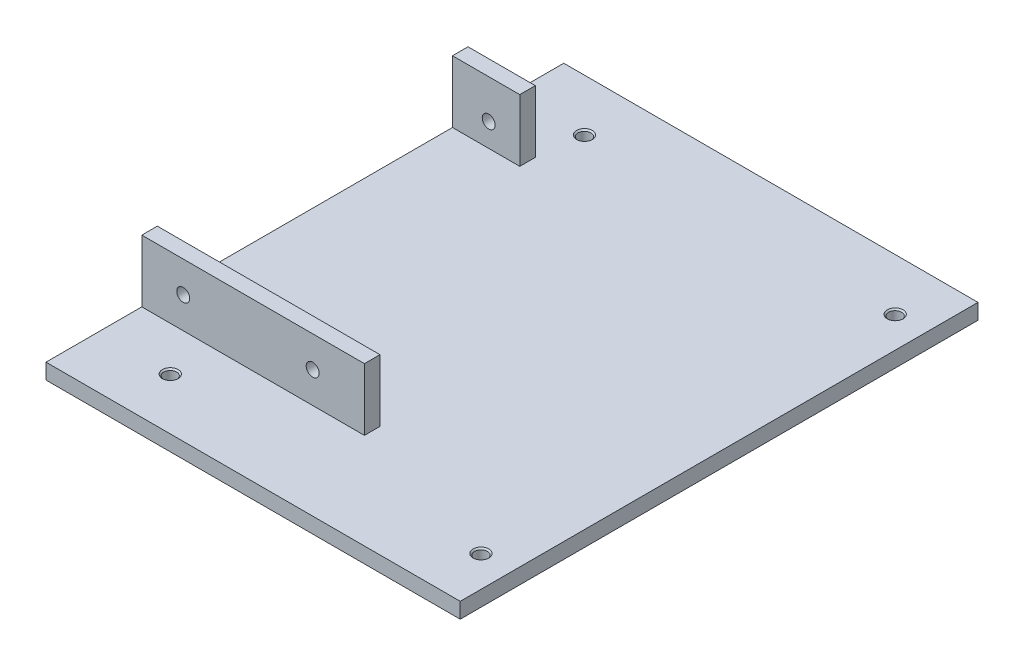
ISO-10303-21;
HEADER;
FILE_DESCRIPTION(('STEP AP214'),'2;1');
FILE_NAME('part.step','',(''),(''),'','','');
FILE_SCHEMA(('AUTOMOTIVE_DESIGN { 1 0 10303 214 1 1 1 1 }'));
ENDSEC;
DATA;
#1=APPLICATION_CONTEXT('core data for automotive mechanical design processes');
#2=APPLICATION_PROTOCOL_DEFINITION('international standard','automotive_design',2000,#1);
#3=PRODUCT_CONTEXT('',#1,'mechanical');
#4=PRODUCT('Part','Part','',(#3));
#5=PRODUCT_RELATED_PRODUCT_CATEGORY('part','',(#4));
#6=PRODUCT_DEFINITION_FORMATION('','',#4);
#7=PRODUCT_DEFINITION_CONTEXT('part definition',#1,'design');
#8=PRODUCT_DEFINITION('design','',#6,#7);
#9=PRODUCT_DEFINITION_SHAPE('','',#8);
#10=(LENGTH_UNIT() NAMED_UNIT(*) SI_UNIT(.MILLI.,.METRE.));
#11=(NAMED_UNIT(*) PLANE_ANGLE_UNIT() SI_UNIT($,.RADIAN.));
#12=(NAMED_UNIT(*) SI_UNIT($,.STERADIAN.) SOLID_ANGLE_UNIT());
#13=UNCERTAINTY_MEASURE_WITH_UNIT(LENGTH_MEASURE(1.E-05),#10,'distance_accuracy_value','');
#14=(GEOMETRIC_REPRESENTATION_CONTEXT(3) GLOBAL_UNCERTAINTY_ASSIGNED_CONTEXT((#13)) GLOBAL_UNIT_ASSIGNED_CONTEXT((#10,
#11,#12)) REPRESENTATION_CONTEXT('',''));
#15=CARTESIAN_POINT('',(0.,0.,0.));
#16=DIRECTION('',(0.,0.,1.));
#17=DIRECTION('',(1.,0.,0.));
#18=AXIS2_PLACEMENT_3D('',#15,#16,#17);
#19=CARTESIAN_POINT('',(0.,0.,-9.83755723121744));
#20=DIRECTION('',(0.,0.,1.));
#21=DIRECTION('',(1.,0.,0.));
#22=AXIS2_PLACEMENT_3D('',#19,#20,#21);
#23=PLANE('',#22);
#24=DIRECTION('',(1.,0.,0.));
#25=VECTOR('',#24,1.);
#26=CARTESIAN_POINT('',(-60.7657345094222,3.,-9.83755723121744));
#27=LINE('',#26,#25);
#28=CARTESIAN_POINT('',(-60.7657345094222,3.,-9.83755723121744));
#29=VERTEX_POINT('',#28);
#30=CARTESIAN_POINT('',(-47.7657345094222,3.,-9.83755723121744));
#31=VERTEX_POINT('',#30);
#32=EDGE_CURVE('E113',#29,#31,#27,.T.);
#33=ORIENTED_EDGE('',*,*,#32,.F.);
#34=DIRECTION('',(0.,1.,0.));
#35=VECTOR('',#34,1.);
#36=CARTESIAN_POINT('',(-60.7657345094222,3.,-9.83755723121744));
#37=LINE('',#36,#35);
#38=CARTESIAN_POINT('',(-60.7657345094222,15.,-9.83755723121744));
#39=VERTEX_POINT('',#38);
#40=EDGE_CURVE('E103',#29,#39,#37,.T.);
#41=ORIENTED_EDGE('',*,*,#40,.T.);
#42=DIRECTION('',(1.,0.,0.));
#43=VECTOR('',#42,1.);
#44=CARTESIAN_POINT('',(-60.7657345094222,15.,-9.83755723121744));
#45=LINE('',#44,#43);
#46=CARTESIAN_POINT('',(-47.7657345094222,15.,-9.83755723121744));
#47=VERTEX_POINT('',#46);
#48=EDGE_CURVE('E98',#39,#47,#45,.T.);
#49=ORIENTED_EDGE('',*,*,#48,.T.);
#50=DIRECTION('',(0.,1.,0.));
#51=VECTOR('',#50,1.);
#52=CARTESIAN_POINT('',(-47.7657345094222,3.,-9.83755723121744));
#53=LINE('',#52,#51);
#54=EDGE_CURVE('E102',#31,#47,#53,.T.);
#55=ORIENTED_EDGE('',*,*,#54,.F.);
#56=EDGE_LOOP('',(#33,#41,#49,#55));
#57=FACE_BOUND('',#56,.T.);
#58=CARTESIAN_POINT('',(-53.7657345094222,7.5,-9.83755723121744));
#59=DIRECTION('',(0.,0.,-1.));
#60=DIRECTION('',(-1.,0.,0.));
#61=AXIS2_PLACEMENT_3D('',#58,#59,#60);
#62=CIRCLE('',#61,1.24999999999999);
#63=CARTESIAN_POINT('',(-55.0157345094222,7.5,-9.83755723121744));
#64=VERTEX_POINT('',#63);
#65=EDGE_CURVE('E192',#64,#64,#62,.T.);
#66=ORIENTED_EDGE('',*,*,#65,.F.);
#67=EDGE_LOOP('',(#66));
#68=FACE_BOUND('',#67,.T.);
#69=ADVANCED_FACE('F52',(#57,#68),#23,.F.);
#70=CARTESIAN_POINT('',(-60.7657345094222,3.,-9.83755723121744));
#71=DIRECTION('',(0.,-1.,0.));
#72=DIRECTION('',(1.,0.,0.));
#73=AXIS2_PLACEMENT_3D('',#70,#71,#72);
#74=PLANE('',#73);
#75=DIRECTION('',(1.,0.,0.));
#76=VECTOR('',#75,1.);
#77=CARTESIAN_POINT('',(-60.7657345094222,3.,-6.83755723121744));
#78=LINE('',#77,#76);
#79=CARTESIAN_POINT('',(-60.7657345094222,3.,-6.83755723121744));
#80=VERTEX_POINT('',#79);
#81=CARTESIAN_POINT('',(-47.7657345094222,3.,-6.83755723121744));
#82=VERTEX_POINT('',#81);
#83=EDGE_CURVE('E119',#80,#82,#78,.T.);
#84=ORIENTED_EDGE('',*,*,#83,.F.);
#85=DIRECTION('',(0.,0.,1.));
#86=VECTOR('',#85,1.);
#87=CARTESIAN_POINT('',(-60.7657345094222,3.,-9.83755723121744));
#88=LINE('',#87,#86);
#89=EDGE_CURVE('E12',#29,#80,#88,.T.);
#90=ORIENTED_EDGE('',*,*,#89,.F.);
#91=ORIENTED_EDGE('',*,*,#32,.T.);
#92=DIRECTION('',(0.,0.,1.));
#93=VECTOR('',#92,1.);
#94=CARTESIAN_POINT('',(-47.7657345094222,3.,-9.83755723121744));
#95=LINE('',#94,#93);
#96=EDGE_CURVE('E56',#31,#82,#95,.T.);
#97=ORIENTED_EDGE('',*,*,#96,.T.);
#98=EDGE_LOOP('',(#84,#90,#91,#97));
#99=FACE_BOUND('',#98,.T.);
#100=ADVANCED_FACE('F54',(#99),#74,.T.);
#101=CARTESIAN_POINT('',(-60.7657345094222,3.,-9.83755723121744));
#102=DIRECTION('',(1.,0.,0.));
#103=DIRECTION('',(0.,0.,-1.));
#104=AXIS2_PLACEMENT_3D('',#101,#102,#103);
#105=PLANE('',#104);
#106=DIRECTION('',(0.,1.,0.));
#107=VECTOR('',#106,1.);
#108=CARTESIAN_POINT('',(-60.7657345094222,3.,-6.83755723121744));
#109=LINE('',#108,#107);
#110=CARTESIAN_POINT('',(-60.7657345094222,15.,-6.83755723121744));
#111=VERTEX_POINT('',#110);
#112=EDGE_CURVE('E86',#80,#111,#109,.T.);
#113=ORIENTED_EDGE('',*,*,#112,.T.);
#114=DIRECTION('',(0.,0.,1.));
#115=VECTOR('',#114,1.);
#116=CARTESIAN_POINT('',(-60.7657345094222,15.,-9.83755723121744));
#117=LINE('',#116,#115);
#118=EDGE_CURVE('E62',#39,#111,#117,.T.);
#119=ORIENTED_EDGE('',*,*,#118,.F.);
#120=ORIENTED_EDGE('',*,*,#40,.F.);
#121=ORIENTED_EDGE('',*,*,#89,.T.);
#122=EDGE_LOOP('',(#113,#119,#120,#121));
#123=FACE_BOUND('',#122,.T.);
#124=ADVANCED_FACE('F130',(#123),#105,.F.);
#125=CARTESIAN_POINT('',(-60.7657345094222,15.,-9.83755723121744));
#126=DIRECTION('',(0.,-1.,0.));
#127=DIRECTION('',(1.,0.,0.));
#128=AXIS2_PLACEMENT_3D('',#125,#126,#127);
#129=PLANE('',#128);
#130=DIRECTION('',(1.,0.,0.));
#131=VECTOR('',#130,1.);
#132=CARTESIAN_POINT('',(-60.7657345094222,15.,-6.83755723121744));
#133=LINE('',#132,#131);
#134=CARTESIAN_POINT('',(-47.7657345094222,15.,-6.83755723121744));
#135=VERTEX_POINT('',#134);
#136=EDGE_CURVE('E110',#111,#135,#133,.T.);
#137=ORIENTED_EDGE('',*,*,#136,.T.);
#138=DIRECTION('',(0.,0.,1.));
#139=VECTOR('',#138,1.);
#140=CARTESIAN_POINT('',(-47.7657345094222,15.,-9.83755723121744));
#141=LINE('',#140,#139);
#142=EDGE_CURVE('E107',#47,#135,#141,.T.);
#143=ORIENTED_EDGE('',*,*,#142,.F.);
#144=ORIENTED_EDGE('',*,*,#48,.F.);
#145=ORIENTED_EDGE('',*,*,#118,.T.);
#146=EDGE_LOOP('',(#137,#143,#144,#145));
#147=FACE_BOUND('',#146,.T.);
#148=ADVANCED_FACE('F108',(#147),#129,.F.);
#149=CARTESIAN_POINT('',(-47.7657345094222,3.,-9.83755723121744));
#150=DIRECTION('',(1.,0.,0.));
#151=DIRECTION('',(0.,0.,-1.));
#152=AXIS2_PLACEMENT_3D('',#149,#150,#151);
#153=PLANE('',#152);
#154=DIRECTION('',(0.,1.,0.));
#155=VECTOR('',#154,1.);
#156=CARTESIAN_POINT('',(-47.7657345094222,3.,-6.83755723121744));
#157=LINE('',#156,#155);
#158=EDGE_CURVE('E122',#82,#135,#157,.T.);
#159=ORIENTED_EDGE('',*,*,#158,.F.);
#160=ORIENTED_EDGE('',*,*,#96,.F.);
#161=ORIENTED_EDGE('',*,*,#54,.T.);
#162=ORIENTED_EDGE('',*,*,#142,.T.);
#163=EDGE_LOOP('',(#159,#160,#161,#162));
#164=FACE_BOUND('',#163,.T.);
#165=ADVANCED_FACE('F112',(#164),#153,.T.);
#166=CARTESIAN_POINT('',(0.,0.,-6.83755723121744));
#167=DIRECTION('',(0.,0.,1.));
#168=DIRECTION('',(1.,0.,0.));
#169=AXIS2_PLACEMENT_3D('',#166,#167,#168);
#170=PLANE('',#169);
#171=CARTESIAN_POINT('',(-53.7657345094222,7.5,-6.83755723121744));
#172=DIRECTION('',(0.,0.,1.));
#173=DIRECTION('',(1.,0.,0.));
#174=AXIS2_PLACEMENT_3D('',#171,#172,#173);
#175=CIRCLE('',#174,1.24999999999999);
#176=CARTESIAN_POINT('',(-52.5157345094223,7.5,-6.83755723121744));
#177=VERTEX_POINT('',#176);
#178=EDGE_CURVE('E123',#177,#177,#175,.T.);
#179=ORIENTED_EDGE('',*,*,#178,.F.);
#180=EDGE_LOOP('',(#179));
#181=FACE_BOUND('',#180,.T.);
#182=ORIENTED_EDGE('',*,*,#83,.T.);
#183=ORIENTED_EDGE('',*,*,#158,.T.);
#184=ORIENTED_EDGE('',*,*,#136,.F.);
#185=ORIENTED_EDGE('',*,*,#112,.F.);
#186=EDGE_LOOP('',(#182,#183,#184,#185));
#187=FACE_BOUND('',#186,.T.);
#188=ADVANCED_FACE('F128',(#181,#187),#170,.T.);
#189=CARTESIAN_POINT('',(-53.7657345094222,7.5,-9.83755723121744));
#190=DIRECTION('',(0.,0.,-1.));
#191=DIRECTION('',(-1.,0.,0.));
#192=AXIS2_PLACEMENT_3D('',#189,#190,#191);
#193=CYLINDRICAL_SURFACE('',#192,1.24999999999999);
#194=ORIENTED_EDGE('',*,*,#65,.T.);
#195=EDGE_LOOP('',(#194));
#196=FACE_BOUND('',#195,.T.);
#197=ORIENTED_EDGE('',*,*,#178,.T.);
#198=EDGE_LOOP('',(#197));
#199=FACE_BOUND('',#198,.T.);
#200=ADVANCED_FACE('F141',(#196,#199),#193,.F.);
#201=CLOSED_SHELL('',(#69,#100,#124,#148,#165,#188,#200));
#202=MANIFOLD_SOLID_BREP('B2',#201);
#203=CARTESIAN_POINT('',(-17.7657345094222,3.,53.1624427687826));
#204=DIRECTION('',(-1.,0.,0.));
#205=DIRECTION('',(0.,0.,1.));
#206=AXIS2_PLACEMENT_3D('',#203,#204,#205);
#207=PLANE('',#206);
#208=DIRECTION('',(0.,1.,0.));
#209=VECTOR('',#208,1.);
#210=CARTESIAN_POINT('',(-17.7657345094222,3.,50.1624427687826));
#211=LINE('',#210,#209);
#212=CARTESIAN_POINT('',(-17.7657345094222,3.,50.1624427687826));
#213=VERTEX_POINT('',#212);
#214=CARTESIAN_POINT('',(-17.7657345094222,15.,50.1624427687826));
#215=VERTEX_POINT('',#214);
#216=EDGE_CURVE('E271',#213,#215,#211,.T.);
#217=ORIENTED_EDGE('',*,*,#216,.T.);
#218=DIRECTION('',(0.,0.,-1.));
#219=VECTOR('',#218,1.);
#220=CARTESIAN_POINT('',(-17.7657345094222,15.,53.1624427687826));
#221=LINE('',#220,#219);
#222=CARTESIAN_POINT('',(-17.7657345094222,15.,53.1624427687826));
#223=VERTEX_POINT('',#222);
#224=EDGE_CURVE('E50',#223,#215,#221,.T.);
#225=ORIENTED_EDGE('',*,*,#224,.F.);
#226=DIRECTION('',(0.,1.,0.));
#227=VECTOR('',#226,1.);
#228=CARTESIAN_POINT('',(-17.7657345094222,3.,53.1624427687826));
#229=LINE('',#228,#227);
#230=CARTESIAN_POINT('',(-17.7657345094222,3.,53.1624427687826));
#231=VERTEX_POINT('',#230);
#232=EDGE_CURVE('E259',#231,#223,#229,.T.);
#233=ORIENTED_EDGE('',*,*,#232,.F.);
#234=DIRECTION('',(0.,0.,-1.));
#235=VECTOR('',#234,1.);
#236=CARTESIAN_POINT('',(-17.7657345094222,3.,53.1624427687826));
#237=LINE('',#236,#235);
#238=EDGE_CURVE('E267',#231,#213,#237,.T.);
#239=ORIENTED_EDGE('',*,*,#238,.T.);
#240=EDGE_LOOP('',(#217,#225,#233,#239));
#241=FACE_BOUND('',#240,.T.);
#242=ADVANCED_FACE('F208',(#241),#207,.F.);
#243=CARTESIAN_POINT('',(-17.7657345094222,15.,53.1624427687826));
#244=DIRECTION('',(0.,-1.,0.));
#245=DIRECTION('',(1.,0.,0.));
#246=AXIS2_PLACEMENT_3D('',#243,#244,#245);
#247=PLANE('',#246);
#248=DIRECTION('',(-1.,0.,0.));
#249=VECTOR('',#248,1.);
#250=CARTESIAN_POINT('',(-17.7657345094222,15.,50.1624427687826));
#251=LINE('',#250,#249);
#252=CARTESIAN_POINT('',(-60.7657345094222,15.,50.1624427687826));
#253=VERTEX_POINT('',#252);
#254=EDGE_CURVE('E263',#215,#253,#251,.T.);
#255=ORIENTED_EDGE('',*,*,#254,.T.);
#256=DIRECTION('',(0.,0.,-1.));
#257=VECTOR('',#256,1.);
#258=CARTESIAN_POINT('',(-60.7657345094222,15.,53.1624427687826));
#259=LINE('',#258,#257);
#260=CARTESIAN_POINT('',(-60.7657345094222,15.,53.1624427687826));
#261=VERTEX_POINT('',#260);
#262=EDGE_CURVE('E216',#261,#253,#259,.T.);
#263=ORIENTED_EDGE('',*,*,#262,.F.);
#264=DIRECTION('',(-1.,0.,0.));
#265=VECTOR('',#264,1.);
#266=CARTESIAN_POINT('',(-17.7657345094222,15.,53.1624427687826));
#267=LINE('',#266,#265);
#268=EDGE_CURVE('E254',#223,#261,#267,.T.);
#269=ORIENTED_EDGE('',*,*,#268,.F.);
#270=ORIENTED_EDGE('',*,*,#224,.T.);
#271=EDGE_LOOP('',(#255,#263,#269,#270));
#272=FACE_BOUND('',#271,.T.);
#273=ADVANCED_FACE('F262',(#272),#247,.F.);
#274=CARTESIAN_POINT('',(-60.7657345094222,3.,53.1624427687826));
#275=DIRECTION('',(1.,0.,0.));
#276=DIRECTION('',(0.,0.,-1.));
#277=AXIS2_PLACEMENT_3D('',#274,#275,#276);
#278=PLANE('',#277);
#279=DIRECTION('',(0.,-1.,0.));
#280=VECTOR('',#279,1.);
#281=CARTESIAN_POINT('',(-60.7657345094222,3.,50.1624427687826));
#282=LINE('',#281,#280);
#283=CARTESIAN_POINT('',(-60.7657345094222,3.,50.1624427687826));
#284=VERTEX_POINT('',#283);
#285=EDGE_CURVE('E241',#253,#284,#282,.T.);
#286=ORIENTED_EDGE('',*,*,#285,.T.);
#287=DIRECTION('',(0.,0.,-1.));
#288=VECTOR('',#287,1.);
#289=CARTESIAN_POINT('',(-60.7657345094222,3.,53.1624427687826));
#290=LINE('',#289,#288);
#291=CARTESIAN_POINT('',(-60.7657345094222,3.,53.1624427687826));
#292=VERTEX_POINT('',#291);
#293=EDGE_CURVE('E264',#292,#284,#290,.T.);
#294=ORIENTED_EDGE('',*,*,#293,.F.);
#295=DIRECTION('',(0.,-1.,0.));
#296=VECTOR('',#295,1.);
#297=CARTESIAN_POINT('',(-60.7657345094222,3.,53.1624427687826));
#298=LINE('',#297,#296);
#299=EDGE_CURVE('E257',#261,#292,#298,.T.);
#300=ORIENTED_EDGE('',*,*,#299,.F.);
#301=ORIENTED_EDGE('',*,*,#262,.T.);
#302=EDGE_LOOP('',(#286,#294,#300,#301));
#303=FACE_BOUND('',#302,.T.);
#304=ADVANCED_FACE('F265',(#303),#278,.F.);
#305=CARTESIAN_POINT('',(-17.7657345094222,3.,53.1624427687826));
#306=DIRECTION('',(0.,1.,0.));
#307=DIRECTION('',(0.,0.,1.));
#308=AXIS2_PLACEMENT_3D('',#305,#306,#307);
#309=PLANE('',#308);
#310=DIRECTION('',(1.,0.,0.));
#311=VECTOR('',#310,1.);
#312=CARTESIAN_POINT('',(-17.7657345094222,3.,50.1624427687826));
#313=LINE('',#312,#311);
#314=EDGE_CURVE('E247',#284,#213,#313,.T.);
#315=ORIENTED_EDGE('',*,*,#314,.T.);
#316=ORIENTED_EDGE('',*,*,#238,.F.);
#317=DIRECTION('',(1.,0.,0.));
#318=VECTOR('',#317,1.);
#319=CARTESIAN_POINT('',(-17.7657345094222,3.,53.1624427687826));
#320=LINE('',#319,#318);
#321=EDGE_CURVE('E224',#292,#231,#320,.T.);
#322=ORIENTED_EDGE('',*,*,#321,.F.);
#323=ORIENTED_EDGE('',*,*,#293,.T.);
#324=EDGE_LOOP('',(#315,#316,#322,#323));
#325=FACE_BOUND('',#324,.T.);
#326=ADVANCED_FACE('F279',(#325),#309,.F.);
#327=CARTESIAN_POINT('',(0.,0.,53.1624427687826));
#328=DIRECTION('',(0.,0.,1.));
#329=DIRECTION('',(1.,0.,0.));
#330=AXIS2_PLACEMENT_3D('',#327,#328,#329);
#331=PLANE('',#330);
#332=CARTESIAN_POINT('',(-52.7657345094222,9.,53.1624427687826));
#333=DIRECTION('',(0.,0.,1.));
#334=DIRECTION('',(1.,0.,0.));
#335=AXIS2_PLACEMENT_3D('',#332,#333,#334);
#336=CIRCLE('',#335,1.24999999999999);
#337=CARTESIAN_POINT('',(-51.5157345094223,9.,53.1624427687826));
#338=VERTEX_POINT('',#337);
#339=EDGE_CURVE('E293',#338,#338,#336,.T.);
#340=ORIENTED_EDGE('',*,*,#339,.F.);
#341=EDGE_LOOP('',(#340));
#342=FACE_BOUND('',#341,.T.);
#343=CARTESIAN_POINT('',(-27.7657345094222,9.,53.1624427687826));
#344=DIRECTION('',(0.,0.,1.));
#345=DIRECTION('',(1.,0.,0.));
#346=AXIS2_PLACEMENT_3D('',#343,#344,#345);
#347=CIRCLE('',#346,1.24999999999999);
#348=CARTESIAN_POINT('',(-26.5157345094223,9.,53.1624427687826));
#349=VERTEX_POINT('',#348);
#350=EDGE_CURVE('E287',#349,#349,#347,.T.);
#351=ORIENTED_EDGE('',*,*,#350,.F.);
#352=EDGE_LOOP('',(#351));
#353=FACE_BOUND('',#352,.T.);
#354=ORIENTED_EDGE('',*,*,#232,.T.);
#355=ORIENTED_EDGE('',*,*,#268,.T.);
#356=ORIENTED_EDGE('',*,*,#299,.T.);
#357=ORIENTED_EDGE('',*,*,#321,.T.);
#358=EDGE_LOOP('',(#354,#355,#356,#357));
#359=FACE_BOUND('',#358,.T.);
#360=ADVANCED_FACE('F255',(#342,#353,#359),#331,.T.);
#361=CARTESIAN_POINT('',(0.,0.,50.1624427687826));
#362=DIRECTION('',(0.,0.,1.));
#363=DIRECTION('',(1.,0.,0.));
#364=AXIS2_PLACEMENT_3D('',#361,#362,#363);
#365=PLANE('',#364);
#366=CARTESIAN_POINT('',(-52.7657345094222,9.,50.1624427687826));
#367=DIRECTION('',(0.,0.,1.));
#368=DIRECTION('',(1.,0.,0.));
#369=AXIS2_PLACEMENT_3D('',#366,#367,#368);
#370=CIRCLE('',#369,1.24999999999999);
#371=CARTESIAN_POINT('',(-51.5157345094222,9.,50.1624427687826));
#372=VERTEX_POINT('',#371);
#373=EDGE_CURVE('E290',#372,#372,#370,.T.);
#374=ORIENTED_EDGE('',*,*,#373,.T.);
#375=EDGE_LOOP('',(#374));
#376=FACE_BOUND('',#375,.T.);
#377=CARTESIAN_POINT('',(-27.7657345094222,9.,50.1624427687826));
#378=DIRECTION('',(0.,0.,1.));
#379=DIRECTION('',(1.,0.,0.));
#380=AXIS2_PLACEMENT_3D('',#377,#378,#379);
#381=CIRCLE('',#380,1.24999999999999);
#382=CARTESIAN_POINT('',(-26.5157345094223,9.,50.1624427687826));
#383=VERTEX_POINT('',#382);
#384=EDGE_CURVE('E274',#383,#383,#381,.T.);
#385=ORIENTED_EDGE('',*,*,#384,.T.);
#386=EDGE_LOOP('',(#385));
#387=FACE_BOUND('',#386,.T.);
#388=ORIENTED_EDGE('',*,*,#216,.F.);
#389=ORIENTED_EDGE('',*,*,#314,.F.);
#390=ORIENTED_EDGE('',*,*,#285,.F.);
#391=ORIENTED_EDGE('',*,*,#254,.F.);
#392=EDGE_LOOP('',(#388,#389,#390,#391));
#393=FACE_BOUND('',#392,.T.);
#394=ADVANCED_FACE('F282',(#376,#387,#393),#365,.F.);
#395=CARTESIAN_POINT('',(-27.7657345094222,9.,53.1624427687826));
#396=DIRECTION('',(0.,0.,1.));
#397=DIRECTION('',(1.,0.,0.));
#398=AXIS2_PLACEMENT_3D('',#395,#396,#397);
#399=CYLINDRICAL_SURFACE('',#398,1.24999999999999);
#400=ORIENTED_EDGE('',*,*,#384,.F.);
#401=EDGE_LOOP('',(#400));
#402=FACE_BOUND('',#401,.T.);
#403=ORIENTED_EDGE('',*,*,#350,.T.);
#404=EDGE_LOOP('',(#403));
#405=FACE_BOUND('',#404,.T.);
#406=ADVANCED_FACE('F304',(#402,#405),#399,.F.);
#407=CARTESIAN_POINT('',(-52.7657345094222,9.,53.1624427687826));
#408=DIRECTION('',(0.,0.,1.));
#409=DIRECTION('',(1.,0.,0.));
#410=AXIS2_PLACEMENT_3D('',#407,#408,#409);
#411=CYLINDRICAL_SURFACE('',#410,1.24999999999999);
#412=ORIENTED_EDGE('',*,*,#373,.F.);
#413=EDGE_LOOP('',(#412));
#414=FACE_BOUND('',#413,.T.);
#415=ORIENTED_EDGE('',*,*,#339,.T.);
#416=EDGE_LOOP('',(#415));
#417=FACE_BOUND('',#416,.T.);
#418=ADVANCED_FACE('F297',(#414,#417),#411,.F.);
#419=CLOSED_SHELL('',(#242,#273,#304,#326,#360,#394,#406,#418));
#420=MANIFOLD_SOLID_BREP('B6',#419);
#421=CARTESIAN_POINT('',(-60.7657345094222,3.,-28.3375572312174));
#422=DIRECTION('',(1.,0.,0.));
#423=DIRECTION('',(0.,0.,-1.));
#424=AXIS2_PLACEMENT_3D('',#421,#422,#423);
#425=PLANE('',#424);
#426=DIRECTION('',(0.,0.,1.));
#427=VECTOR('',#426,1.);
#428=CARTESIAN_POINT('',(-60.7657345094222,0.,-28.3375572312174));
#429=LINE('',#428,#427);
#430=CARTESIAN_POINT('',(-60.7657345094222,0.,-28.3375572312174));
#431=VERTEX_POINT('',#430);
#432=CARTESIAN_POINT('',(-60.7657345094222,0.,71.6624427687826));
#433=VERTEX_POINT('',#432);
#434=EDGE_CURVE('E413',#431,#433,#429,.T.);
#435=ORIENTED_EDGE('',*,*,#434,.T.);
#436=DIRECTION('',(0.,-1.,0.));
#437=VECTOR('',#436,1.);
#438=CARTESIAN_POINT('',(-60.7657345094222,3.,71.6624427687826));
#439=LINE('',#438,#437);
#440=CARTESIAN_POINT('',(-60.7657345094222,3.,71.6624427687826));
#441=VERTEX_POINT('',#440);
#442=EDGE_CURVE('E389',#441,#433,#439,.T.);
#443=ORIENTED_EDGE('',*,*,#442,.F.);
#444=DIRECTION('',(0.,0.,1.));
#445=VECTOR('',#444,1.);
#446=CARTESIAN_POINT('',(-60.7657345094222,3.,-28.3375572312174));
#447=LINE('',#446,#445);
#448=CARTESIAN_POINT('',(-60.7657345094222,3.,-28.3375572312174));
#449=VERTEX_POINT('',#448);
#450=EDGE_CURVE('E432',#449,#441,#447,.T.);
#451=ORIENTED_EDGE('',*,*,#450,.F.);
#452=DIRECTION('',(0.,-1.,0.));
#453=VECTOR('',#452,1.);
#454=CARTESIAN_POINT('',(-60.7657345094222,3.,-28.3375572312174));
#455=LINE('',#454,#453);
#456=EDGE_CURVE('E206',#449,#431,#455,.T.);
#457=ORIENTED_EDGE('',*,*,#456,.T.);
#458=EDGE_LOOP('',(#435,#443,#451,#457));
#459=FACE_BOUND('',#458,.T.);
#460=ADVANCED_FACE('F378',(#459),#425,.F.);
#461=CARTESIAN_POINT('',(0.,0.,0.));
#462=DIRECTION('',(0.,-1.,0.));
#463=DIRECTION('',(0.,0.,-1.));
#464=AXIS2_PLACEMENT_3D('',#461,#462,#463);
#465=PLANE('',#464);
#466=DIRECTION('',(1.,0.,0.));
#467=VECTOR('',#466,1.);
#468=CARTESIAN_POINT('',(-60.7657345094222,0.,71.6624427687826));
#469=LINE('',#468,#467);
#470=CARTESIAN_POINT('',(19.2342654905778,0.,71.6624427687826));
#471=VERTEX_POINT('',#470);
#472=EDGE_CURVE('E440',#433,#471,#469,.T.);
#473=ORIENTED_EDGE('',*,*,#472,.F.);
#474=ORIENTED_EDGE('',*,*,#434,.F.);
#475=DIRECTION('',(1.,0.,0.));
#476=VECTOR('',#475,1.);
#477=CARTESIAN_POINT('',(-60.7657345094222,0.,-28.3375572312174));
#478=LINE('',#477,#476);
#479=CARTESIAN_POINT('',(19.2342654905778,0.,-28.3375572312174));
#480=VERTEX_POINT('',#479);
#481=EDGE_CURVE('E454',#431,#480,#478,.T.);
#482=ORIENTED_EDGE('',*,*,#481,.T.);
#483=DIRECTION('',(0.,0.,1.));
#484=VECTOR('',#483,1.);
#485=CARTESIAN_POINT('',(19.2342654905778,0.,-28.3375572312174));
#486=LINE('',#485,#484);
#487=EDGE_CURVE('E458',#480,#471,#486,.T.);
#488=ORIENTED_EDGE('',*,*,#487,.T.);
#489=EDGE_LOOP('',(#473,#474,#482,#488));
#490=FACE_BOUND('',#489,.T.);
#491=CARTESIAN_POINT('',(-46.7657345094222,0.,-18.3375572312174));
#492=DIRECTION('',(0.,-1.,0.));
#493=DIRECTION('',(0.,0.,-1.));
#494=AXIS2_PLACEMENT_3D('',#491,#492,#493);
#495=CIRCLE('',#494,1.24999999999999);
#496=CARTESIAN_POINT('',(-46.7657345094222,0.,-19.5875572312174));
#497=VERTEX_POINT('',#496);
#498=EDGE_CURVE('E382',#497,#497,#495,.T.);
#499=ORIENTED_EDGE('',*,*,#498,.F.);
#500=EDGE_LOOP('',(#499));
#501=FACE_BOUND('',#500,.T.);
#502=CARTESIAN_POINT('',(13.2342654905778,0.,-18.3375572312174));
#503=DIRECTION('',(0.,-1.,0.));
#504=DIRECTION('',(0.,0.,-1.));
#505=AXIS2_PLACEMENT_3D('',#502,#503,#504);
#506=CIRCLE('',#505,1.25);
#507=CARTESIAN_POINT('',(13.2342654905778,0.,-19.5875572312174));
#508=VERTEX_POINT('',#507);
#509=EDGE_CURVE('E479',#508,#508,#506,.T.);
#510=ORIENTED_EDGE('',*,*,#509,.F.);
#511=EDGE_LOOP('',(#510));
#512=FACE_BOUND('',#511,.T.);
#513=CARTESIAN_POINT('',(13.2342654905778,0.,61.6624427687825));
#514=DIRECTION('',(0.,-1.,0.));
#515=DIRECTION('',(0.,0.,-1.));
#516=AXIS2_PLACEMENT_3D('',#513,#514,#515);
#517=CIRCLE('',#516,1.25);
#518=CARTESIAN_POINT('',(13.2342654905778,0.,60.4124427687826));
#519=VERTEX_POINT('',#518);
#520=EDGE_CURVE('E474',#519,#519,#517,.T.);
#521=ORIENTED_EDGE('',*,*,#520,.F.);
#522=EDGE_LOOP('',(#521));
#523=FACE_BOUND('',#522,.T.);
#524=CARTESIAN_POINT('',(-46.7657345094222,0.,61.6624427687825));
#525=DIRECTION('',(0.,-1.,0.));
#526=DIRECTION('',(0.,0.,-1.));
#527=AXIS2_PLACEMENT_3D('',#524,#525,#526);
#528=CIRCLE('',#527,1.24999999999999);
#529=CARTESIAN_POINT('',(-46.7657345094222,0.,60.4124427687826));
#530=VERTEX_POINT('',#529);
#531=EDGE_CURVE('E459',#530,#530,#528,.T.);
#532=ORIENTED_EDGE('',*,*,#531,.F.);
#533=EDGE_LOOP('',(#532));
#534=FACE_BOUND('',#533,.T.);
#535=ADVANCED_FACE('F528',(#490,#501,#512,#523,#534),#465,.T.);
#536=CARTESIAN_POINT('',(-60.7657345094222,3.,-28.3375572312174));
#537=DIRECTION('',(0.,0.,-1.));
#538=DIRECTION('',(-1.,0.,0.));
#539=AXIS2_PLACEMENT_3D('',#536,#537,#538);
#540=PLANE('',#539);
#541=ORIENTED_EDGE('',*,*,#481,.F.);
#542=ORIENTED_EDGE('',*,*,#456,.F.);
#543=DIRECTION('',(1.,0.,0.));
#544=VECTOR('',#543,1.);
#545=CARTESIAN_POINT('',(-60.7657345094222,3.,-28.3375572312174));
#546=LINE('',#545,#544);
#547=CARTESIAN_POINT('',(19.2342654905778,3.,-28.3375572312174));
#548=VERTEX_POINT('',#547);
#549=EDGE_CURVE('E446',#449,#548,#546,.T.);
#550=ORIENTED_EDGE('',*,*,#549,.T.);
#551=DIRECTION('',(0.,-1.,0.));
#552=VECTOR('',#551,1.);
#553=CARTESIAN_POINT('',(19.2342654905778,3.,-28.3375572312174));
#554=LINE('',#553,#552);
#555=EDGE_CURVE('E421',#548,#480,#554,.T.);
#556=ORIENTED_EDGE('',*,*,#555,.T.);
#557=EDGE_LOOP('',(#541,#542,#550,#556));
#558=FACE_BOUND('',#557,.T.);
#559=ADVANCED_FACE('F380',(#558),#540,.T.);
#560=CARTESIAN_POINT('',(-60.7657345094222,3.,71.6624427687826));
#561=DIRECTION('',(0.,0.,-1.));
#562=DIRECTION('',(-1.,0.,0.));
#563=AXIS2_PLACEMENT_3D('',#560,#561,#562);
#564=PLANE('',#563);
#565=ORIENTED_EDGE('',*,*,#472,.T.);
#566=DIRECTION('',(0.,-1.,0.));
#567=VECTOR('',#566,1.);
#568=CARTESIAN_POINT('',(19.2342654905778,3.,71.6624427687826));
#569=LINE('',#568,#567);
#570=CARTESIAN_POINT('',(19.2342654905778,3.,71.6624427687826));
#571=VERTEX_POINT('',#570);
#572=EDGE_CURVE('E437',#571,#471,#569,.T.);
#573=ORIENTED_EDGE('',*,*,#572,.F.);
#574=DIRECTION('',(1.,0.,0.));
#575=VECTOR('',#574,1.);
#576=CARTESIAN_POINT('',(-60.7657345094222,3.,71.6624427687826));
#577=LINE('',#576,#575);
#578=EDGE_CURVE('E426',#441,#571,#577,.T.);
#579=ORIENTED_EDGE('',*,*,#578,.F.);
#580=ORIENTED_EDGE('',*,*,#442,.T.);
#581=EDGE_LOOP('',(#565,#573,#579,#580));
#582=FACE_BOUND('',#581,.T.);
#583=ADVANCED_FACE('F438',(#582),#564,.F.);
#584=CARTESIAN_POINT('',(19.2342654905778,3.,-28.3375572312174));
#585=DIRECTION('',(1.,0.,0.));
#586=DIRECTION('',(0.,0.,-1.));
#587=AXIS2_PLACEMENT_3D('',#584,#585,#586);
#588=PLANE('',#587);
#589=ORIENTED_EDGE('',*,*,#487,.F.);
#590=ORIENTED_EDGE('',*,*,#555,.F.);
#591=DIRECTION('',(0.,0.,1.));
#592=VECTOR('',#591,1.);
#593=CARTESIAN_POINT('',(19.2342654905778,3.,-28.3375572312174));
#594=LINE('',#593,#592);
#595=EDGE_CURVE('E431',#548,#571,#594,.T.);
#596=ORIENTED_EDGE('',*,*,#595,.T.);
#597=ORIENTED_EDGE('',*,*,#572,.T.);
#598=EDGE_LOOP('',(#589,#590,#596,#597));
#599=FACE_BOUND('',#598,.T.);
#600=ADVANCED_FACE('F444',(#599),#588,.T.);
#601=CARTESIAN_POINT('',(0.,3.,0.));
#602=DIRECTION('',(0.,-1.,0.));
#603=DIRECTION('',(0.,0.,-1.));
#604=AXIS2_PLACEMENT_3D('',#601,#602,#603);
#605=PLANE('',#604);
#606=ORIENTED_EDGE('',*,*,#450,.T.);
#607=ORIENTED_EDGE('',*,*,#578,.T.);
#608=ORIENTED_EDGE('',*,*,#595,.F.);
#609=ORIENTED_EDGE('',*,*,#549,.F.);
#610=EDGE_LOOP('',(#606,#607,#608,#609));
#611=FACE_BOUND('',#610,.T.);
#612=CARTESIAN_POINT('',(-46.7657345094222,3.,-18.3375572312174));
#613=DIRECTION('',(0.,1.,0.));
#614=DIRECTION('',(0.,0.,1.));
#615=AXIS2_PLACEMENT_3D('',#612,#613,#614);
#616=CIRCLE('',#615,1.525);
#617=CARTESIAN_POINT('',(-46.7657345094222,3.,-16.8125572312174));
#618=VERTEX_POINT('',#617);
#619=EDGE_CURVE('E586',#618,#618,#616,.T.);
#620=ORIENTED_EDGE('',*,*,#619,.F.);
#621=EDGE_LOOP('',(#620));
#622=FACE_BOUND('',#621,.T.);
#623=CARTESIAN_POINT('',(13.2342654905778,3.,-18.3375572312174));
#624=DIRECTION('',(0.,1.,0.));
#625=DIRECTION('',(0.,0.,1.));
#626=AXIS2_PLACEMENT_3D('',#623,#624,#625);
#627=CIRCLE('',#626,1.525);
#628=CARTESIAN_POINT('',(13.2342654905778,3.,-16.8125572312174));
#629=VERTEX_POINT('',#628);
#630=EDGE_CURVE('E491',#629,#629,#627,.T.);
#631=ORIENTED_EDGE('',*,*,#630,.F.);
#632=EDGE_LOOP('',(#631));
#633=FACE_BOUND('',#632,.T.);
#634=CARTESIAN_POINT('',(13.2342654905778,3.,61.6624427687825));
#635=DIRECTION('',(0.,1.,0.));
#636=DIRECTION('',(0.,0.,1.));
#637=AXIS2_PLACEMENT_3D('',#634,#635,#636);
#638=CIRCLE('',#637,1.525);
#639=CARTESIAN_POINT('',(13.2342654905778,3.,63.1874427687825));
#640=VERTEX_POINT('',#639);
#641=EDGE_CURVE('E482',#640,#640,#638,.T.);
#642=ORIENTED_EDGE('',*,*,#641,.F.);
#643=EDGE_LOOP('',(#642));
#644=FACE_BOUND('',#643,.T.);
#645=CARTESIAN_POINT('',(-46.7657345094222,3.,61.6624427687825));
#646=DIRECTION('',(0.,1.,0.));
#647=DIRECTION('',(0.,0.,1.));
#648=AXIS2_PLACEMENT_3D('',#645,#646,#647);
#649=CIRCLE('',#648,1.525);
#650=CARTESIAN_POINT('',(-46.7657345094222,3.,63.1874427687825));
#651=VERTEX_POINT('',#650);
#652=EDGE_CURVE('E477',#651,#651,#649,.T.);
#653=ORIENTED_EDGE('',*,*,#652,.F.);
#654=EDGE_LOOP('',(#653));
#655=FACE_BOUND('',#654,.T.);
#656=ADVANCED_FACE('F428',(#611,#622,#633,#644,#655),#605,.F.);
#657=CARTESIAN_POINT('',(-46.7657345094222,3.,61.6624427687825));
#658=DIRECTION('',(0.,1.,0.));
#659=DIRECTION('',(0.,0.,1.));
#660=AXIS2_PLACEMENT_3D('',#657,#658,#659);
#661=CYLINDRICAL_SURFACE('',#660,1.24999999999999);
#662=ORIENTED_EDGE('',*,*,#531,.T.);
#663=EDGE_LOOP('',(#662));
#664=FACE_BOUND('',#663,.T.);
#665=CARTESIAN_POINT('',(-46.7657345094222,2.725,61.6624427687825));
#666=DIRECTION('',(0.,1.,0.));
#667=DIRECTION('',(0.,0.,1.));
#668=AXIS2_PLACEMENT_3D('',#665,#666,#667);
#669=CIRCLE('',#668,1.24999999999999);
#670=CARTESIAN_POINT('',(-46.7657345094222,2.725,62.9124427687825));
#671=VERTEX_POINT('',#670);
#672=EDGE_CURVE('E473',#671,#671,#669,.T.);
#673=ORIENTED_EDGE('',*,*,#672,.T.);
#674=EDGE_LOOP('',(#673));
#675=FACE_BOUND('',#674,.T.);
#676=ADVANCED_FACE('F509',(#664,#675),#661,.F.);
#677=CARTESIAN_POINT('',(-46.7657345094222,3.,61.6624427687825));
#678=DIRECTION('',(0.,1.,0.));
#679=DIRECTION('',(0.,0.,1.));
#680=AXIS2_PLACEMENT_3D('',#677,#678,#679);
#681=CONICAL_SURFACE('',#680,1.525,0.785398163397453);
#682=ORIENTED_EDGE('',*,*,#672,.F.);
#683=EDGE_LOOP('',(#682));
#684=FACE_BOUND('',#683,.T.);
#685=ORIENTED_EDGE('',*,*,#652,.T.);
#686=EDGE_LOOP('',(#685));
#687=FACE_BOUND('',#686,.T.);
#688=ADVANCED_FACE('F511',(#684,#687),#681,.F.);
#689=CARTESIAN_POINT('',(13.2342654905778,3.,61.6624427687825));
#690=DIRECTION('',(0.,1.,0.));
#691=DIRECTION('',(0.,0.,1.));
#692=AXIS2_PLACEMENT_3D('',#689,#690,#691);
#693=CYLINDRICAL_SURFACE('',#692,1.25);
#694=ORIENTED_EDGE('',*,*,#520,.T.);
#695=EDGE_LOOP('',(#694));
#696=FACE_BOUND('',#695,.T.);
#697=CARTESIAN_POINT('',(13.2342654905778,2.725,61.6624427687825));
#698=DIRECTION('',(0.,1.,0.));
#699=DIRECTION('',(0.,0.,1.));
#700=AXIS2_PLACEMENT_3D('',#697,#698,#699);
#701=CIRCLE('',#700,1.25);
#702=CARTESIAN_POINT('',(13.2342654905778,2.725,62.9124427687825));
#703=VERTEX_POINT('',#702);
#704=EDGE_CURVE('E478',#703,#703,#701,.T.);
#705=ORIENTED_EDGE('',*,*,#704,.T.);
#706=EDGE_LOOP('',(#705));
#707=FACE_BOUND('',#706,.T.);
#708=ADVANCED_FACE('F514',(#696,#707),#693,.F.);
#709=CARTESIAN_POINT('',(13.2342654905778,3.,61.6624427687825));
#710=DIRECTION('',(0.,1.,0.));
#711=DIRECTION('',(0.,0.,1.));
#712=AXIS2_PLACEMENT_3D('',#709,#710,#711);
#713=CONICAL_SURFACE('',#712,1.525,0.78539816339745);
#714=ORIENTED_EDGE('',*,*,#704,.F.);
#715=EDGE_LOOP('',(#714));
#716=FACE_BOUND('',#715,.T.);
#717=ORIENTED_EDGE('',*,*,#641,.T.);
#718=EDGE_LOOP('',(#717));
#719=FACE_BOUND('',#718,.T.);
#720=ADVANCED_FACE('F552',(#716,#719),#713,.F.);
#721=CARTESIAN_POINT('',(13.2342654905778,3.,-18.3375572312174));
#722=DIRECTION('',(0.,1.,0.));
#723=DIRECTION('',(0.,0.,1.));
#724=AXIS2_PLACEMENT_3D('',#721,#722,#723);
#725=CYLINDRICAL_SURFACE('',#724,1.25);
#726=ORIENTED_EDGE('',*,*,#509,.T.);
#727=EDGE_LOOP('',(#726));
#728=FACE_BOUND('',#727,.T.);
#729=CARTESIAN_POINT('',(13.2342654905778,2.725,-18.3375572312174));
#730=DIRECTION('',(0.,1.,0.));
#731=DIRECTION('',(0.,0.,1.));
#732=AXIS2_PLACEMENT_3D('',#729,#730,#731);
#733=CIRCLE('',#732,1.25);
#734=CARTESIAN_POINT('',(13.2342654905778,2.725,-17.0875572312174));
#735=VERTEX_POINT('',#734);
#736=EDGE_CURVE('E483',#735,#735,#733,.T.);
#737=ORIENTED_EDGE('',*,*,#736,.T.);
#738=EDGE_LOOP('',(#737));
#739=FACE_BOUND('',#738,.T.);
#740=ADVANCED_FACE('F558',(#728,#739),#725,.F.);
#741=CARTESIAN_POINT('',(13.2342654905778,3.,-18.3375572312174));
#742=DIRECTION('',(0.,1.,0.));
#743=DIRECTION('',(0.,0.,1.));
#744=AXIS2_PLACEMENT_3D('',#741,#742,#743);
#745=CONICAL_SURFACE('',#744,1.525,0.78539816339745);
#746=ORIENTED_EDGE('',*,*,#736,.F.);
#747=EDGE_LOOP('',(#746));
#748=FACE_BOUND('',#747,.T.);
#749=ORIENTED_EDGE('',*,*,#630,.T.);
#750=EDGE_LOOP('',(#749));
#751=FACE_BOUND('',#750,.T.);
#752=ADVANCED_FACE('F565',(#748,#751),#745,.F.);
#753=CARTESIAN_POINT('',(-46.7657345094222,3.,-18.3375572312174));
#754=DIRECTION('',(0.,1.,0.));
#755=DIRECTION('',(0.,0.,1.));
#756=AXIS2_PLACEMENT_3D('',#753,#754,#755);
#757=CYLINDRICAL_SURFACE('',#756,1.24999999999999);
#758=ORIENTED_EDGE('',*,*,#498,.T.);
#759=EDGE_LOOP('',(#758));
#760=FACE_BOUND('',#759,.T.);
#761=CARTESIAN_POINT('',(-46.7657345094222,2.725,-18.3375572312174));
#762=DIRECTION('',(0.,1.,0.));
#763=DIRECTION('',(0.,0.,1.));
#764=AXIS2_PLACEMENT_3D('',#761,#762,#763);
#765=CIRCLE('',#764,1.24999999999999);
#766=CARTESIAN_POINT('',(-46.7657345094222,2.725,-17.0875572312174));
#767=VERTEX_POINT('',#766);
#768=EDGE_CURVE('E583',#767,#767,#765,.T.);
#769=ORIENTED_EDGE('',*,*,#768,.T.);
#770=EDGE_LOOP('',(#769));
#771=FACE_BOUND('',#770,.T.);
#772=ADVANCED_FACE('F570',(#760,#771),#757,.F.);
#773=CARTESIAN_POINT('',(-46.7657345094222,3.,-18.3375572312174));
#774=DIRECTION('',(0.,1.,0.));
#775=DIRECTION('',(0.,0.,1.));
#776=AXIS2_PLACEMENT_3D('',#773,#774,#775);
#777=CONICAL_SURFACE('',#776,1.525,0.785398163397453);
#778=ORIENTED_EDGE('',*,*,#768,.F.);
#779=EDGE_LOOP('',(#778));
#780=FACE_BOUND('',#779,.T.);
#781=ORIENTED_EDGE('',*,*,#619,.T.);
#782=EDGE_LOOP('',(#781));
#783=FACE_BOUND('',#782,.T.);
#784=ADVANCED_FACE('F574',(#780,#783),#777,.F.);
#785=CLOSED_SHELL('',(#460,#535,#559,#583,#600,#656,#676,#688,#708,#720,#740,#752,#772,#784));
#786=MANIFOLD_SOLID_BREP('B44',#785);
#787=ADVANCED_BREP_SHAPE_REPRESENTATION('',(#18,#202,#420,#786),#14);
#788=SHAPE_DEFINITION_REPRESENTATION(#9,#787);
ENDSEC;
END-ISO-10303-21;
